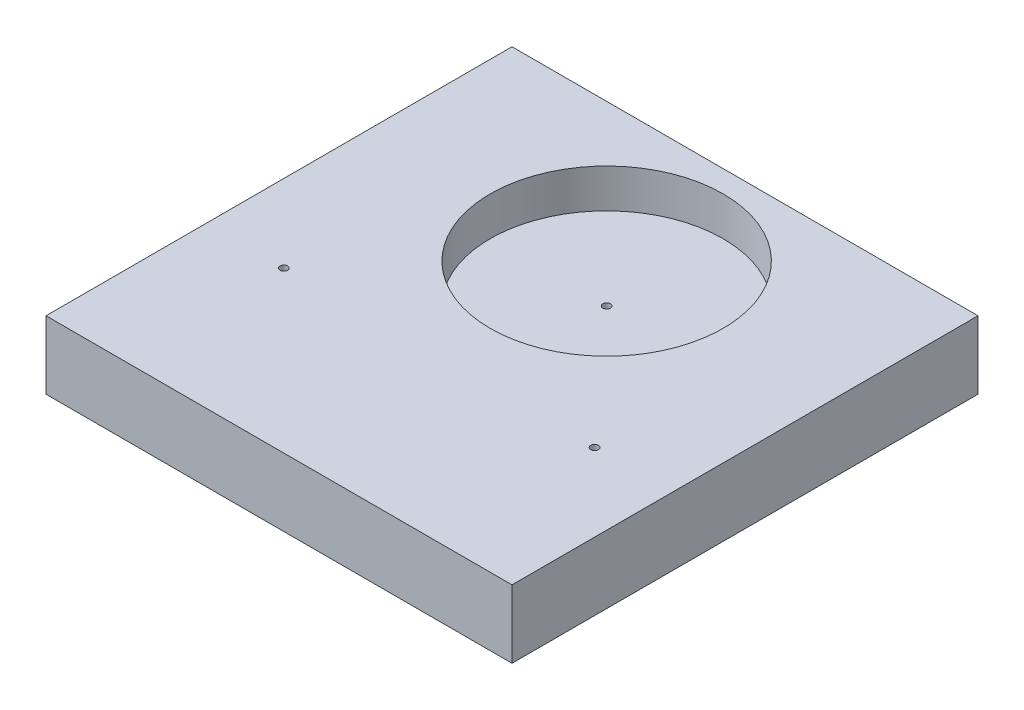
ISO-10303-21;
HEADER;
FILE_DESCRIPTION(('STEP AP214'),'2;1');
FILE_NAME('part.step','',(''),(''),'','','');
FILE_SCHEMA(('AUTOMOTIVE_DESIGN { 1 0 10303 214 1 1 1 1 }'));
ENDSEC;
DATA;
#1=APPLICATION_CONTEXT('core data for automotive mechanical design processes');
#2=APPLICATION_PROTOCOL_DEFINITION('international standard','automotive_design',2000,#1);
#3=PRODUCT_CONTEXT('',#1,'mechanical');
#4=PRODUCT('Part','Part','',(#3));
#5=PRODUCT_RELATED_PRODUCT_CATEGORY('part','',(#4));
#6=PRODUCT_DEFINITION_FORMATION('','',#4);
#7=PRODUCT_DEFINITION_CONTEXT('part definition',#1,'design');
#8=PRODUCT_DEFINITION('design','',#6,#7);
#9=PRODUCT_DEFINITION_SHAPE('','',#8);
#10=(LENGTH_UNIT() NAMED_UNIT(*) SI_UNIT(.MILLI.,.METRE.));
#11=(NAMED_UNIT(*) PLANE_ANGLE_UNIT() SI_UNIT($,.RADIAN.));
#12=(NAMED_UNIT(*) SI_UNIT($,.STERADIAN.) SOLID_ANGLE_UNIT());
#13=UNCERTAINTY_MEASURE_WITH_UNIT(LENGTH_MEASURE(1.E-05),#10,'distance_accuracy_value','');
#14=(GEOMETRIC_REPRESENTATION_CONTEXT(3) GLOBAL_UNCERTAINTY_ASSIGNED_CONTEXT((#13)) GLOBAL_UNIT_ASSIGNED_CONTEXT((#10,
#11,#12)) REPRESENTATION_CONTEXT('',''));
#15=CARTESIAN_POINT('',(0.,0.,0.));
#16=DIRECTION('',(0.,0.,1.));
#17=DIRECTION('',(1.,0.,0.));
#18=AXIS2_PLACEMENT_3D('',#15,#16,#17);
#19=CARTESIAN_POINT('',(-76.2,-11.1125,76.2));
#20=DIRECTION('',(1.,0.,0.));
#21=DIRECTION('',(0.,0.,-1.));
#22=AXIS2_PLACEMENT_3D('',#19,#20,#21);
#23=PLANE('',#22);
#24=DIRECTION('',(0.,-1.,0.));
#25=VECTOR('',#24,1.);
#26=CARTESIAN_POINT('',(-76.2,-11.1125,-76.2));
#27=LINE('',#26,#25);
#28=CARTESIAN_POINT('',(-76.2,11.1125,-76.2));
#29=VERTEX_POINT('',#28);
#30=CARTESIAN_POINT('',(-76.2,-11.1125,-76.2));
#31=VERTEX_POINT('',#30);
#32=EDGE_CURVE('E103',#29,#31,#27,.T.);
#33=ORIENTED_EDGE('',*,*,#32,.T.);
#34=DIRECTION('',(0.,0.,-1.));
#35=VECTOR('',#34,1.);
#36=CARTESIAN_POINT('',(-76.2,-11.1125,76.2));
#37=LINE('',#36,#35);
#38=CARTESIAN_POINT('',(-76.2,-11.1125,76.2));
#39=VERTEX_POINT('',#38);
#40=EDGE_CURVE('E11',#39,#31,#37,.T.);
#41=ORIENTED_EDGE('',*,*,#40,.F.);
#42=DIRECTION('',(0.,-1.,0.));
#43=VECTOR('',#42,1.);
#44=CARTESIAN_POINT('',(-76.2,-11.1125,76.2));
#45=LINE('',#44,#43);
#46=CARTESIAN_POINT('',(-76.2,11.1125,76.2));
#47=VERTEX_POINT('',#46);
#48=EDGE_CURVE('E90',#47,#39,#45,.T.);
#49=ORIENTED_EDGE('',*,*,#48,.F.);
#50=DIRECTION('',(0.,0.,-1.));
#51=VECTOR('',#50,1.);
#52=CARTESIAN_POINT('',(-76.2,11.1125,76.2));
#53=LINE('',#52,#51);
#54=EDGE_CURVE('E99',#47,#29,#53,.T.);
#55=ORIENTED_EDGE('',*,*,#54,.T.);
#56=EDGE_LOOP('',(#33,#41,#49,#55));
#57=FACE_BOUND('',#56,.T.);
#58=ADVANCED_FACE('F38',(#57),#23,.F.);
#59=CARTESIAN_POINT('',(76.2,-11.1125,76.2));
#60=DIRECTION('',(0.,1.,0.));
#61=DIRECTION('',(0.,0.,1.));
#62=AXIS2_PLACEMENT_3D('',#59,#60,#61);
#63=PLANE('',#62);
#64=CARTESIAN_POINT('',(0.,-11.1125,-30.95625));
#65=DIRECTION('',(0.,-1.,0.));
#66=DIRECTION('',(0.,0.,-1.));
#67=AXIS2_PLACEMENT_3D('',#64,#65,#66);
#68=CIRCLE('',#67,1.525);
#69=CARTESIAN_POINT('',(0.,-11.1125,-32.48125));
#70=VERTEX_POINT('',#69);
#71=EDGE_CURVE('E137',#70,#70,#68,.T.);
#72=ORIENTED_EDGE('',*,*,#71,.F.);
#73=EDGE_LOOP('',(#72));
#74=FACE_BOUND('',#73,.T.);
#75=CARTESIAN_POINT('',(50.8,-11.1125,23.8125));
#76=DIRECTION('',(0.,-1.,0.));
#77=DIRECTION('',(0.,0.,-1.));
#78=AXIS2_PLACEMENT_3D('',#75,#76,#77);
#79=CIRCLE('',#78,1.24999999999999);
#80=CARTESIAN_POINT('',(50.8,-11.1125,22.5625));
#81=VERTEX_POINT('',#80);
#82=EDGE_CURVE('E125',#81,#81,#79,.T.);
#83=ORIENTED_EDGE('',*,*,#82,.F.);
#84=EDGE_LOOP('',(#83));
#85=FACE_BOUND('',#84,.T.);
#86=CARTESIAN_POINT('',(-50.8,-11.1125,23.8125));
#87=DIRECTION('',(0.,-1.,0.));
#88=DIRECTION('',(0.,0.,-1.));
#89=AXIS2_PLACEMENT_3D('',#86,#87,#88);
#90=CIRCLE('',#89,1.24999999999999);
#91=CARTESIAN_POINT('',(-50.8,-11.1125,22.5625));
#92=VERTEX_POINT('',#91);
#93=EDGE_CURVE('E119',#92,#92,#90,.T.);
#94=ORIENTED_EDGE('',*,*,#93,.F.);
#95=EDGE_LOOP('',(#94));
#96=FACE_BOUND('',#95,.T.);
#97=DIRECTION('',(1.,0.,0.));
#98=VECTOR('',#97,1.);
#99=CARTESIAN_POINT('',(76.2,-11.1125,-76.2));
#100=LINE('',#99,#98);
#101=CARTESIAN_POINT('',(76.2,-11.1125,-76.2));
#102=VERTEX_POINT('',#101);
#103=EDGE_CURVE('E94',#31,#102,#100,.T.);
#104=ORIENTED_EDGE('',*,*,#103,.T.);
#105=DIRECTION('',(0.,0.,-1.));
#106=VECTOR('',#105,1.);
#107=CARTESIAN_POINT('',(76.2,-11.1125,76.2));
#108=LINE('',#107,#106);
#109=CARTESIAN_POINT('',(76.2,-11.1125,76.2));
#110=VERTEX_POINT('',#109);
#111=EDGE_CURVE('E47',#110,#102,#108,.T.);
#112=ORIENTED_EDGE('',*,*,#111,.F.);
#113=DIRECTION('',(1.,0.,0.));
#114=VECTOR('',#113,1.);
#115=CARTESIAN_POINT('',(76.2,-11.1125,76.2));
#116=LINE('',#115,#114);
#117=EDGE_CURVE('E85',#39,#110,#116,.T.);
#118=ORIENTED_EDGE('',*,*,#117,.F.);
#119=ORIENTED_EDGE('',*,*,#40,.T.);
#120=EDGE_LOOP('',(#104,#112,#118,#119));
#121=FACE_BOUND('',#120,.T.);
#122=ADVANCED_FACE('F93',(#74,#85,#96,#121),#63,.F.);
#123=CARTESIAN_POINT('',(76.2,11.1125,76.2));
#124=DIRECTION('',(-1.,0.,0.));
#125=DIRECTION('',(0.,0.,1.));
#126=AXIS2_PLACEMENT_3D('',#123,#124,#125);
#127=PLANE('',#126);
#128=DIRECTION('',(0.,1.,0.));
#129=VECTOR('',#128,1.);
#130=CARTESIAN_POINT('',(76.2,11.1125,-76.2));
#131=LINE('',#130,#129);
#132=CARTESIAN_POINT('',(76.2,11.1125,-76.2));
#133=VERTEX_POINT('',#132);
#134=EDGE_CURVE('E72',#102,#133,#131,.T.);
#135=ORIENTED_EDGE('',*,*,#134,.T.);
#136=DIRECTION('',(0.,0.,-1.));
#137=VECTOR('',#136,1.);
#138=CARTESIAN_POINT('',(76.2,11.1125,76.2));
#139=LINE('',#138,#137);
#140=CARTESIAN_POINT('',(76.2,11.1125,76.2));
#141=VERTEX_POINT('',#140);
#142=EDGE_CURVE('E95',#141,#133,#139,.T.);
#143=ORIENTED_EDGE('',*,*,#142,.F.);
#144=DIRECTION('',(0.,1.,0.));
#145=VECTOR('',#144,1.);
#146=CARTESIAN_POINT('',(76.2,11.1125,76.2));
#147=LINE('',#146,#145);
#148=EDGE_CURVE('E88',#110,#141,#147,.T.);
#149=ORIENTED_EDGE('',*,*,#148,.F.);
#150=ORIENTED_EDGE('',*,*,#111,.T.);
#151=EDGE_LOOP('',(#135,#143,#149,#150));
#152=FACE_BOUND('',#151,.T.);
#153=ADVANCED_FACE('F97',(#152),#127,.F.);
#154=CARTESIAN_POINT('',(-76.2,11.1125,76.2));
#155=DIRECTION('',(0.,-1.,0.));
#156=DIRECTION('',(0.,0.,-1.));
#157=AXIS2_PLACEMENT_3D('',#154,#155,#156);
#158=PLANE('',#157);
#159=CARTESIAN_POINT('',(0.,11.1125,-30.95625));
#160=DIRECTION('',(0.,1.,0.));
#161=DIRECTION('',(0.,0.,1.));
#162=AXIS2_PLACEMENT_3D('',#159,#160,#161);
#163=CIRCLE('',#162,38.1);
#164=CARTESIAN_POINT('',(0.,11.1125,7.14375000000001));
#165=VERTEX_POINT('',#164);
#166=EDGE_CURVE('E129',#165,#165,#163,.T.);
#167=ORIENTED_EDGE('',*,*,#166,.F.);
#168=EDGE_LOOP('',(#167));
#169=FACE_BOUND('',#168,.T.);
#170=CARTESIAN_POINT('',(50.8,11.1125,23.8125));
#171=DIRECTION('',(0.,-1.,0.));
#172=DIRECTION('',(0.,0.,-1.));
#173=AXIS2_PLACEMENT_3D('',#170,#171,#172);
#174=CIRCLE('',#173,1.24999999999999);
#175=CARTESIAN_POINT('',(50.8,11.1125,22.5625));
#176=VERTEX_POINT('',#175);
#177=EDGE_CURVE('E122',#176,#176,#174,.T.);
#178=ORIENTED_EDGE('',*,*,#177,.T.);
#179=EDGE_LOOP('',(#178));
#180=FACE_BOUND('',#179,.T.);
#181=CARTESIAN_POINT('',(-50.8,11.1125,23.8125));
#182=DIRECTION('',(0.,-1.,0.));
#183=DIRECTION('',(0.,0.,-1.));
#184=AXIS2_PLACEMENT_3D('',#181,#182,#183);
#185=CIRCLE('',#184,1.24999999999999);
#186=CARTESIAN_POINT('',(-50.8,11.1125,22.5625));
#187=VERTEX_POINT('',#186);
#188=EDGE_CURVE('E106',#187,#187,#185,.T.);
#189=ORIENTED_EDGE('',*,*,#188,.T.);
#190=EDGE_LOOP('',(#189));
#191=FACE_BOUND('',#190,.T.);
#192=DIRECTION('',(-1.,0.,0.));
#193=VECTOR('',#192,1.);
#194=CARTESIAN_POINT('',(-76.2,11.1125,-76.2));
#195=LINE('',#194,#193);
#196=EDGE_CURVE('E78',#133,#29,#195,.T.);
#197=ORIENTED_EDGE('',*,*,#196,.T.);
#198=ORIENTED_EDGE('',*,*,#54,.F.);
#199=DIRECTION('',(-1.,0.,0.));
#200=VECTOR('',#199,1.);
#201=CARTESIAN_POINT('',(-76.2,11.1125,76.2));
#202=LINE('',#201,#200);
#203=EDGE_CURVE('E55',#141,#47,#202,.T.);
#204=ORIENTED_EDGE('',*,*,#203,.F.);
#205=ORIENTED_EDGE('',*,*,#142,.T.);
#206=EDGE_LOOP('',(#197,#198,#204,#205));
#207=FACE_BOUND('',#206,.T.);
#208=ADVANCED_FACE('F111',(#169,#180,#191,#207),#158,.F.);
#209=CARTESIAN_POINT('',(0.,0.,76.2));
#210=DIRECTION('',(0.,0.,-1.));
#211=DIRECTION('',(-1.,0.,0.));
#212=AXIS2_PLACEMENT_3D('',#209,#210,#211);
#213=PLANE('',#212);
#214=ORIENTED_EDGE('',*,*,#48,.T.);
#215=ORIENTED_EDGE('',*,*,#117,.T.);
#216=ORIENTED_EDGE('',*,*,#148,.T.);
#217=ORIENTED_EDGE('',*,*,#203,.T.);
#218=EDGE_LOOP('',(#214,#215,#216,#217));
#219=FACE_BOUND('',#218,.T.);
#220=ADVANCED_FACE('F86',(#219),#213,.F.);
#221=CARTESIAN_POINT('',(0.,0.,-76.2));
#222=DIRECTION('',(0.,0.,-1.));
#223=DIRECTION('',(-1.,0.,0.));
#224=AXIS2_PLACEMENT_3D('',#221,#222,#223);
#225=PLANE('',#224);
#226=ORIENTED_EDGE('',*,*,#32,.F.);
#227=ORIENTED_EDGE('',*,*,#196,.F.);
#228=ORIENTED_EDGE('',*,*,#134,.F.);
#229=ORIENTED_EDGE('',*,*,#103,.F.);
#230=EDGE_LOOP('',(#226,#227,#228,#229));
#231=FACE_BOUND('',#230,.T.);
#232=ADVANCED_FACE('F114',(#231),#225,.T.);
#233=CARTESIAN_POINT('',(-50.8,-11.1125,23.8125));
#234=DIRECTION('',(0.,-1.,0.));
#235=DIRECTION('',(0.,0.,-1.));
#236=AXIS2_PLACEMENT_3D('',#233,#234,#235);
#237=CYLINDRICAL_SURFACE('',#236,1.24999999999999);
#238=ORIENTED_EDGE('',*,*,#188,.F.);
#239=EDGE_LOOP('',(#238));
#240=FACE_BOUND('',#239,.T.);
#241=ORIENTED_EDGE('',*,*,#93,.T.);
#242=EDGE_LOOP('',(#241));
#243=FACE_BOUND('',#242,.T.);
#244=ADVANCED_FACE('F149',(#240,#243),#237,.F.);
#245=CARTESIAN_POINT('',(50.8,-11.1125,23.8125));
#246=DIRECTION('',(0.,-1.,0.));
#247=DIRECTION('',(0.,0.,-1.));
#248=AXIS2_PLACEMENT_3D('',#245,#246,#247);
#249=CYLINDRICAL_SURFACE('',#248,1.24999999999999);
#250=ORIENTED_EDGE('',*,*,#177,.F.);
#251=EDGE_LOOP('',(#250));
#252=FACE_BOUND('',#251,.T.);
#253=ORIENTED_EDGE('',*,*,#82,.T.);
#254=EDGE_LOOP('',(#253));
#255=FACE_BOUND('',#254,.T.);
#256=ADVANCED_FACE('F151',(#252,#255),#249,.F.);
#257=CARTESIAN_POINT('',(0.,-1.5875,-30.95625));
#258=DIRECTION('',(0.,1.,0.));
#259=DIRECTION('',(0.,0.,1.));
#260=AXIS2_PLACEMENT_3D('',#257,#258,#259);
#261=CYLINDRICAL_SURFACE('',#260,38.1);
#262=CARTESIAN_POINT('',(0.,-1.5875,-30.95625));
#263=DIRECTION('',(0.,1.,0.));
#264=DIRECTION('',(0.,0.,1.));
#265=AXIS2_PLACEMENT_3D('',#262,#263,#264);
#266=CIRCLE('',#265,38.1);
#267=CARTESIAN_POINT('',(0.,-1.5875,7.14375000000001));
#268=VERTEX_POINT('',#267);
#269=EDGE_CURVE('E128',#268,#268,#266,.T.);
#270=ORIENTED_EDGE('',*,*,#269,.F.);
#271=EDGE_LOOP('',(#270));
#272=FACE_BOUND('',#271,.T.);
#273=ORIENTED_EDGE('',*,*,#166,.T.);
#274=EDGE_LOOP('',(#273));
#275=FACE_BOUND('',#274,.T.);
#276=ADVANCED_FACE('F158',(#272,#275),#261,.F.);
#277=CARTESIAN_POINT('',(0.,-1.5875,-30.95625));
#278=DIRECTION('',(0.,1.,0.));
#279=DIRECTION('',(0.,0.,1.));
#280=AXIS2_PLACEMENT_3D('',#277,#278,#279);
#281=PLANE('',#280);
#282=CARTESIAN_POINT('',(0.,-1.5875,-30.95625));
#283=DIRECTION('',(0.,1.,0.));
#284=DIRECTION('',(0.,0.,1.));
#285=AXIS2_PLACEMENT_3D('',#282,#283,#284);
#286=CIRCLE('',#285,1.25);
#287=CARTESIAN_POINT('',(0.,-1.5875,-29.70625));
#288=VERTEX_POINT('',#287);
#289=EDGE_CURVE('E41',#288,#288,#286,.T.);
#290=ORIENTED_EDGE('',*,*,#289,.F.);
#291=EDGE_LOOP('',(#290));
#292=FACE_BOUND('',#291,.T.);
#293=ORIENTED_EDGE('',*,*,#269,.T.);
#294=EDGE_LOOP('',(#293));
#295=FACE_BOUND('',#294,.T.);
#296=ADVANCED_FACE('F220',(#292,#295),#281,.T.);
#297=CARTESIAN_POINT('',(0.,-11.1125,-30.95625));
#298=DIRECTION('',(0.,-1.,0.));
#299=DIRECTION('',(0.,0.,-1.));
#300=AXIS2_PLACEMENT_3D('',#297,#298,#299);
#301=CYLINDRICAL_SURFACE('',#300,1.25);
#302=ORIENTED_EDGE('',*,*,#289,.T.);
#303=EDGE_LOOP('',(#302));
#304=FACE_BOUND('',#303,.T.);
#305=CARTESIAN_POINT('',(0.,-10.8375,-30.95625));
#306=DIRECTION('',(0.,-1.,0.));
#307=DIRECTION('',(0.,0.,-1.));
#308=AXIS2_PLACEMENT_3D('',#305,#306,#307);
#309=CIRCLE('',#308,1.25);
#310=CARTESIAN_POINT('',(0.,-10.8375,-32.20625));
#311=VERTEX_POINT('',#310);
#312=EDGE_CURVE('E134',#311,#311,#309,.T.);
#313=ORIENTED_EDGE('',*,*,#312,.T.);
#314=EDGE_LOOP('',(#313));
#315=FACE_BOUND('',#314,.T.);
#316=ADVANCED_FACE('F230',(#304,#315),#301,.F.);
#317=CARTESIAN_POINT('',(0.,-11.1125,-30.95625));
#318=DIRECTION('',(0.,-1.,0.));
#319=DIRECTION('',(0.,0.,-1.));
#320=AXIS2_PLACEMENT_3D('',#317,#318,#319);
#321=CONICAL_SURFACE('',#320,1.525,0.785398163397439);
#322=ORIENTED_EDGE('',*,*,#312,.F.);
#323=EDGE_LOOP('',(#322));
#324=FACE_BOUND('',#323,.T.);
#325=ORIENTED_EDGE('',*,*,#71,.T.);
#326=EDGE_LOOP('',(#325));
#327=FACE_BOUND('',#326,.T.);
#328=ADVANCED_FACE('F141',(#324,#327),#321,.F.);
#329=CLOSED_SHELL('',(#58,#122,#153,#208,#220,#232,#244,#256,#276,#296,#316,#328));
#330=MANIFOLD_SOLID_BREP('B2',#329);
#331=ADVANCED_BREP_SHAPE_REPRESENTATION('',(#18,#330),#14);
#332=SHAPE_DEFINITION_REPRESENTATION(#9,#331);
ENDSEC;
END-ISO-10303-21;
